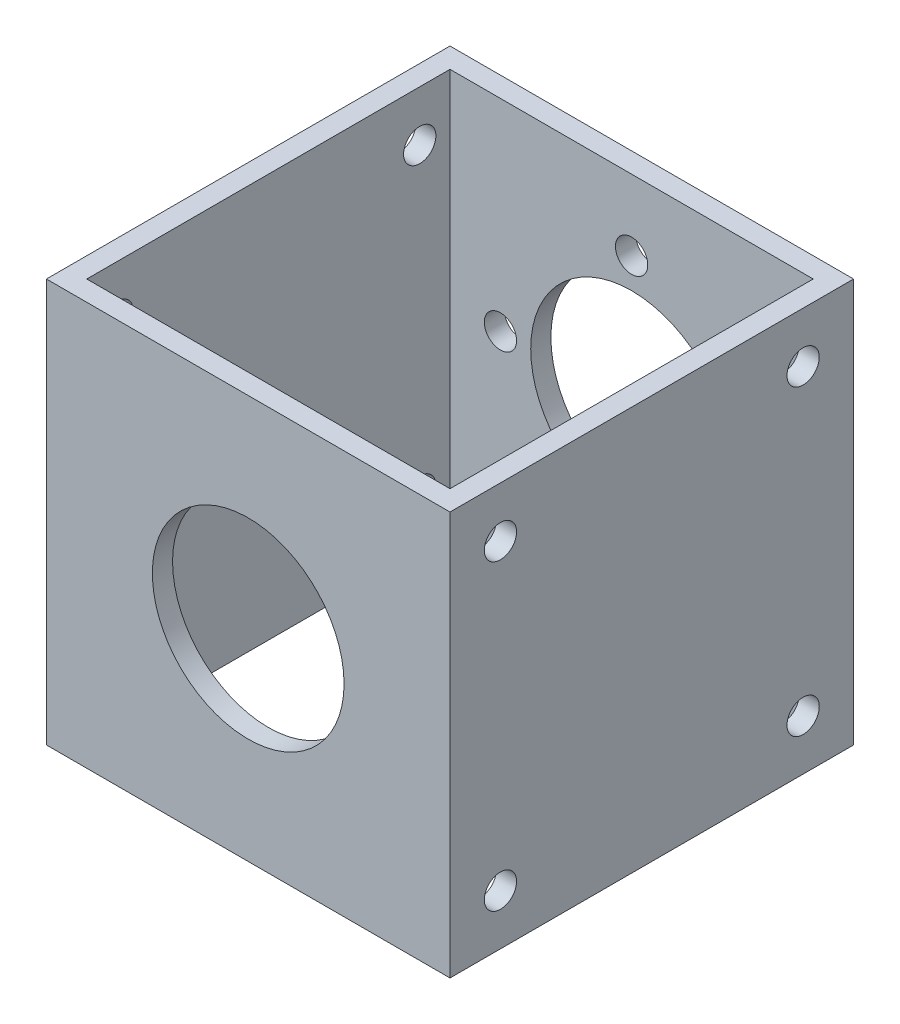
ISO-10303-21;
HEADER;
FILE_DESCRIPTION(('STEP AP214'),'2;1');
FILE_NAME('part.step','',(''),(''),'','','');
FILE_SCHEMA(('AUTOMOTIVE_DESIGN { 1 0 10303 214 1 1 1 1 }'));
ENDSEC;
DATA;
#1=APPLICATION_CONTEXT('core data for automotive mechanical design processes');
#2=APPLICATION_PROTOCOL_DEFINITION('international standard','automotive_design',2000,#1);
#3=PRODUCT_CONTEXT('',#1,'mechanical');
#4=PRODUCT('Part','Part','',(#3));
#5=PRODUCT_RELATED_PRODUCT_CATEGORY('part','',(#4));
#6=PRODUCT_DEFINITION_FORMATION('','',#4);
#7=PRODUCT_DEFINITION_CONTEXT('part definition',#1,'design');
#8=PRODUCT_DEFINITION('design','',#6,#7);
#9=PRODUCT_DEFINITION_SHAPE('','',#8);
#10=(LENGTH_UNIT() NAMED_UNIT(*) SI_UNIT(.MILLI.,.METRE.));
#11=(NAMED_UNIT(*) PLANE_ANGLE_UNIT() SI_UNIT($,.RADIAN.));
#12=(NAMED_UNIT(*) SI_UNIT($,.STERADIAN.) SOLID_ANGLE_UNIT());
#13=UNCERTAINTY_MEASURE_WITH_UNIT(LENGTH_MEASURE(1.E-05),#10,'distance_accuracy_value','');
#14=(GEOMETRIC_REPRESENTATION_CONTEXT(3) GLOBAL_UNCERTAINTY_ASSIGNED_CONTEXT((#13)) GLOBAL_UNIT_ASSIGNED_CONTEXT((#10,
#11,#12)) REPRESENTATION_CONTEXT('',''));
#15=CARTESIAN_POINT('',(0.,0.,0.));
#16=DIRECTION('',(0.,0.,1.));
#17=DIRECTION('',(1.,0.,0.));
#18=AXIS2_PLACEMENT_3D('',#15,#16,#17);
#19=CARTESIAN_POINT('',(0.,40.,0.));
#20=DIRECTION('',(0.,1.,0.));
#21=DIRECTION('',(0.,0.,1.));
#22=AXIS2_PLACEMENT_3D('',#19,#20,#21);
#23=PLANE('',#22);
#24=DIRECTION('',(0.,0.,-1.));
#25=VECTOR('',#24,1.);
#26=CARTESIAN_POINT('',(20.,40.,-20.));
#27=LINE('',#26,#25);
#28=CARTESIAN_POINT('',(20.,40.,20.));
#29=VERTEX_POINT('',#28);
#30=CARTESIAN_POINT('',(20.,40.,-20.));
#31=VERTEX_POINT('',#30);
#32=EDGE_CURVE('E144',#29,#31,#27,.T.);
#33=ORIENTED_EDGE('',*,*,#32,.T.);
#34=DIRECTION('',(-1.,0.,0.));
#35=VECTOR('',#34,1.);
#36=CARTESIAN_POINT('',(-20.,40.,-20.));
#37=LINE('',#36,#35);
#38=CARTESIAN_POINT('',(-20.,40.,-20.));
#39=VERTEX_POINT('',#38);
#40=EDGE_CURVE('E147',#31,#39,#37,.T.);
#41=ORIENTED_EDGE('',*,*,#40,.T.);
#42=DIRECTION('',(0.,0.,1.));
#43=VECTOR('',#42,1.);
#44=CARTESIAN_POINT('',(-20.,40.,-20.));
#45=LINE('',#44,#43);
#46=CARTESIAN_POINT('',(-20.,40.,20.));
#47=VERTEX_POINT('',#46);
#48=EDGE_CURVE('E150',#39,#47,#45,.T.);
#49=ORIENTED_EDGE('',*,*,#48,.T.);
#50=DIRECTION('',(1.,0.,0.));
#51=VECTOR('',#50,1.);
#52=CARTESIAN_POINT('',(-20.,40.,20.));
#53=LINE('',#52,#51);
#54=EDGE_CURVE('E152',#47,#29,#53,.T.);
#55=ORIENTED_EDGE('',*,*,#54,.T.);
#56=EDGE_LOOP('',(#33,#41,#49,#55));
#57=FACE_BOUND('',#56,.T.);
#58=DIRECTION('',(1.,0.,0.));
#59=VECTOR('',#58,1.);
#60=CARTESIAN_POINT('',(-18.,40.,18.));
#61=LINE('',#60,#59);
#62=CARTESIAN_POINT('',(-18.,40.,18.));
#63=VERTEX_POINT('',#62);
#64=CARTESIAN_POINT('',(18.,40.,18.));
#65=VERTEX_POINT('',#64);
#66=EDGE_CURVE('E114',#63,#65,#61,.T.);
#67=ORIENTED_EDGE('',*,*,#66,.F.);
#68=DIRECTION('',(0.,0.,1.));
#69=VECTOR('',#68,1.);
#70=CARTESIAN_POINT('',(-18.,40.,-18.));
#71=LINE('',#70,#69);
#72=CARTESIAN_POINT('',(-18.,40.,-18.));
#73=VERTEX_POINT('',#72);
#74=EDGE_CURVE('E106',#73,#63,#71,.T.);
#75=ORIENTED_EDGE('',*,*,#74,.F.);
#76=DIRECTION('',(-1.,0.,0.));
#77=VECTOR('',#76,1.);
#78=CARTESIAN_POINT('',(-18.,40.,-18.));
#79=LINE('',#78,#77);
#80=CARTESIAN_POINT('',(18.,40.,-18.));
#81=VERTEX_POINT('',#80);
#82=EDGE_CURVE('E128',#81,#73,#79,.T.);
#83=ORIENTED_EDGE('',*,*,#82,.F.);
#84=DIRECTION('',(0.,0.,-1.));
#85=VECTOR('',#84,1.);
#86=CARTESIAN_POINT('',(18.,40.,-18.));
#87=LINE('',#86,#85);
#88=EDGE_CURVE('E126',#65,#81,#87,.T.);
#89=ORIENTED_EDGE('',*,*,#88,.F.);
#90=EDGE_LOOP('',(#67,#75,#83,#89));
#91=FACE_BOUND('',#90,.T.);
#92=ADVANCED_FACE('F39',(#57,#91),#23,.T.);
#93=CARTESIAN_POINT('',(0.,0.,0.));
#94=DIRECTION('',(0.,1.,0.));
#95=DIRECTION('',(0.,0.,1.));
#96=AXIS2_PLACEMENT_3D('',#93,#94,#95);
#97=PLANE('',#96);
#98=DIRECTION('',(0.,0.,-1.));
#99=VECTOR('',#98,1.);
#100=CARTESIAN_POINT('',(20.,0.,-20.));
#101=LINE('',#100,#99);
#102=CARTESIAN_POINT('',(20.,0.,20.));
#103=VERTEX_POINT('',#102);
#104=CARTESIAN_POINT('',(20.,0.,-20.));
#105=VERTEX_POINT('',#104);
#106=EDGE_CURVE('E122',#103,#105,#101,.T.);
#107=ORIENTED_EDGE('',*,*,#106,.F.);
#108=DIRECTION('',(1.,0.,0.));
#109=VECTOR('',#108,1.);
#110=CARTESIAN_POINT('',(-20.,0.,20.));
#111=LINE('',#110,#109);
#112=CARTESIAN_POINT('',(-20.,0.,20.));
#113=VERTEX_POINT('',#112);
#114=EDGE_CURVE('E148',#113,#103,#111,.T.);
#115=ORIENTED_EDGE('',*,*,#114,.F.);
#116=DIRECTION('',(0.,0.,1.));
#117=VECTOR('',#116,1.);
#118=CARTESIAN_POINT('',(-20.,0.,-20.));
#119=LINE('',#118,#117);
#120=CARTESIAN_POINT('',(-20.,0.,-20.));
#121=VERTEX_POINT('',#120);
#122=EDGE_CURVE('E159',#121,#113,#119,.T.);
#123=ORIENTED_EDGE('',*,*,#122,.F.);
#124=DIRECTION('',(-1.,0.,0.));
#125=VECTOR('',#124,1.);
#126=CARTESIAN_POINT('',(-20.,0.,-20.));
#127=LINE('',#126,#125);
#128=EDGE_CURVE('E157',#105,#121,#127,.T.);
#129=ORIENTED_EDGE('',*,*,#128,.F.);
#130=EDGE_LOOP('',(#107,#115,#123,#129));
#131=FACE_BOUND('',#130,.T.);
#132=DIRECTION('',(0.,0.,1.));
#133=VECTOR('',#132,1.);
#134=CARTESIAN_POINT('',(-18.,0.,-18.));
#135=LINE('',#134,#133);
#136=CARTESIAN_POINT('',(-18.,0.,-18.));
#137=VERTEX_POINT('',#136);
#138=CARTESIAN_POINT('',(-18.,0.,18.));
#139=VERTEX_POINT('',#138);
#140=EDGE_CURVE('E64',#137,#139,#135,.T.);
#141=ORIENTED_EDGE('',*,*,#140,.T.);
#142=DIRECTION('',(1.,0.,0.));
#143=VECTOR('',#142,1.);
#144=CARTESIAN_POINT('',(-18.,0.,18.));
#145=LINE('',#144,#143);
#146=CARTESIAN_POINT('',(18.,0.,18.));
#147=VERTEX_POINT('',#146);
#148=EDGE_CURVE('E121',#139,#147,#145,.T.);
#149=ORIENTED_EDGE('',*,*,#148,.T.);
#150=DIRECTION('',(0.,0.,-1.));
#151=VECTOR('',#150,1.);
#152=CARTESIAN_POINT('',(18.,0.,-18.));
#153=LINE('',#152,#151);
#154=CARTESIAN_POINT('',(18.,0.,-18.));
#155=VERTEX_POINT('',#154);
#156=EDGE_CURVE('E136',#147,#155,#153,.T.);
#157=ORIENTED_EDGE('',*,*,#156,.T.);
#158=DIRECTION('',(-1.,0.,0.));
#159=VECTOR('',#158,1.);
#160=CARTESIAN_POINT('',(-18.,0.,-18.));
#161=LINE('',#160,#159);
#162=EDGE_CURVE('E115',#155,#137,#161,.T.);
#163=ORIENTED_EDGE('',*,*,#162,.T.);
#164=EDGE_LOOP('',(#141,#149,#157,#163));
#165=FACE_BOUND('',#164,.T.);
#166=ADVANCED_FACE('F252',(#131,#165),#97,.F.);
#167=CARTESIAN_POINT('',(20.,40.,-20.));
#168=DIRECTION('',(-1.,0.,0.));
#169=DIRECTION('',(0.,0.,1.));
#170=AXIS2_PLACEMENT_3D('',#167,#168,#169);
#171=PLANE('',#170);
#172=CARTESIAN_POINT('',(20.,5.,-15.));
#173=DIRECTION('',(-1.,0.,0.));
#174=DIRECTION('',(0.,0.,-1.));
#175=AXIS2_PLACEMENT_3D('',#172,#173,#174);
#176=CIRCLE('',#175,1.6);
#177=CARTESIAN_POINT('',(20.,5.,-16.6));
#178=VERTEX_POINT('',#177);
#179=EDGE_CURVE('E297',#178,#178,#176,.T.);
#180=ORIENTED_EDGE('',*,*,#179,.T.);
#181=EDGE_LOOP('',(#180));
#182=FACE_BOUND('',#181,.T.);
#183=CARTESIAN_POINT('',(20.,35.,15.));
#184=DIRECTION('',(-1.,0.,0.));
#185=DIRECTION('',(0.,0.,-1.));
#186=AXIS2_PLACEMENT_3D('',#183,#184,#185);
#187=CIRCLE('',#186,1.6);
#188=CARTESIAN_POINT('',(20.,35.,13.4));
#189=VERTEX_POINT('',#188);
#190=EDGE_CURVE('E300',#189,#189,#187,.T.);
#191=ORIENTED_EDGE('',*,*,#190,.T.);
#192=EDGE_LOOP('',(#191));
#193=FACE_BOUND('',#192,.T.);
#194=CARTESIAN_POINT('',(20.,35.,-15.));
#195=DIRECTION('',(-1.,0.,0.));
#196=DIRECTION('',(0.,0.,1.));
#197=AXIS2_PLACEMENT_3D('',#194,#195,#196);
#198=CIRCLE('',#197,1.6);
#199=CARTESIAN_POINT('',(20.,35.,-13.4));
#200=VERTEX_POINT('',#199);
#201=EDGE_CURVE('E306',#200,#200,#198,.T.);
#202=ORIENTED_EDGE('',*,*,#201,.T.);
#203=EDGE_LOOP('',(#202));
#204=FACE_BOUND('',#203,.T.);
#205=CARTESIAN_POINT('',(20.,5.,15.));
#206=DIRECTION('',(-1.,0.,0.));
#207=DIRECTION('',(0.,0.,1.));
#208=AXIS2_PLACEMENT_3D('',#205,#206,#207);
#209=CIRCLE('',#208,1.6);
#210=CARTESIAN_POINT('',(20.,5.,16.6));
#211=VERTEX_POINT('',#210);
#212=EDGE_CURVE('E173',#211,#211,#209,.T.);
#213=ORIENTED_EDGE('',*,*,#212,.T.);
#214=EDGE_LOOP('',(#213));
#215=FACE_BOUND('',#214,.T.);
#216=ORIENTED_EDGE('',*,*,#106,.T.);
#217=DIRECTION('',(0.,-1.,0.));
#218=VECTOR('',#217,1.);
#219=CARTESIAN_POINT('',(20.,40.,-20.));
#220=LINE('',#219,#218);
#221=EDGE_CURVE('E11',#31,#105,#220,.T.);
#222=ORIENTED_EDGE('',*,*,#221,.F.);
#223=ORIENTED_EDGE('',*,*,#32,.F.);
#224=DIRECTION('',(0.,-1.,0.));
#225=VECTOR('',#224,1.);
#226=CARTESIAN_POINT('',(20.,40.,20.));
#227=LINE('',#226,#225);
#228=EDGE_CURVE('E154',#29,#103,#227,.T.);
#229=ORIENTED_EDGE('',*,*,#228,.T.);
#230=EDGE_LOOP('',(#216,#222,#223,#229));
#231=FACE_BOUND('',#230,.T.);
#232=ADVANCED_FACE('F41',(#182,#193,#204,#215,#231),#171,.F.);
#233=CARTESIAN_POINT('',(-20.,40.,-20.));
#234=DIRECTION('',(0.,0.,1.));
#235=DIRECTION('',(1.,0.,0.));
#236=AXIS2_PLACEMENT_3D('',#233,#234,#235);
#237=PLANE('',#236);
#238=CARTESIAN_POINT('',(0.,33.,-20.));
#239=DIRECTION('',(0.,0.,-1.));
#240=DIRECTION('',(-1.,0.,0.));
#241=AXIS2_PLACEMENT_3D('',#238,#239,#240);
#242=CIRCLE('',#241,1.6);
#243=CARTESIAN_POINT('',(-1.6,33.,-20.));
#244=VERTEX_POINT('',#243);
#245=EDGE_CURVE('E217',#244,#244,#242,.T.);
#246=ORIENTED_EDGE('',*,*,#245,.F.);
#247=EDGE_LOOP('',(#246));
#248=FACE_BOUND('',#247,.T.);
#249=CARTESIAN_POINT('',(-13.0000000000002,20.0000000000001,-20.));
#250=DIRECTION('',(0.,0.,-1.));
#251=DIRECTION('',(-1.,0.,0.));
#252=AXIS2_PLACEMENT_3D('',#249,#250,#251);
#253=CIRCLE('',#252,1.6);
#254=CARTESIAN_POINT('',(-14.6000000000002,20.0000000000001,-20.));
#255=VERTEX_POINT('',#254);
#256=EDGE_CURVE('E204',#255,#255,#253,.T.);
#257=ORIENTED_EDGE('',*,*,#256,.F.);
#258=EDGE_LOOP('',(#257));
#259=FACE_BOUND('',#258,.T.);
#260=CARTESIAN_POINT('',(-2.72335544429765E-13,7.,-20.));
#261=DIRECTION('',(0.,0.,-1.));
#262=DIRECTION('',(-1.,0.,0.));
#263=AXIS2_PLACEMENT_3D('',#260,#261,#262);
#264=CIRCLE('',#263,1.6);
#265=CARTESIAN_POINT('',(-1.60000000000027,7.,-20.));
#266=VERTEX_POINT('',#265);
#267=EDGE_CURVE('E205',#266,#266,#264,.T.);
#268=ORIENTED_EDGE('',*,*,#267,.F.);
#269=EDGE_LOOP('',(#268));
#270=FACE_BOUND('',#269,.T.);
#271=CARTESIAN_POINT('',(12.9999999999998,20.,-20.));
#272=DIRECTION('',(0.,0.,-1.));
#273=DIRECTION('',(-1.,0.,0.));
#274=AXIS2_PLACEMENT_3D('',#271,#272,#273);
#275=CIRCLE('',#274,1.6);
#276=CARTESIAN_POINT('',(11.3999999999998,20.,-20.));
#277=VERTEX_POINT('',#276);
#278=EDGE_CURVE('E198',#277,#277,#275,.T.);
#279=ORIENTED_EDGE('',*,*,#278,.F.);
#280=EDGE_LOOP('',(#279));
#281=FACE_BOUND('',#280,.T.);
#282=CARTESIAN_POINT('',(0.,20.,-20.));
#283=DIRECTION('',(0.,0.,-1.));
#284=DIRECTION('',(-1.,0.,0.));
#285=AXIS2_PLACEMENT_3D('',#282,#283,#284);
#286=CIRCLE('',#285,10.);
#287=CARTESIAN_POINT('',(-10.,20.,-20.));
#288=VERTEX_POINT('',#287);
#289=EDGE_CURVE('E134',#288,#288,#286,.T.);
#290=ORIENTED_EDGE('',*,*,#289,.F.);
#291=EDGE_LOOP('',(#290));
#292=FACE_BOUND('',#291,.T.);
#293=ORIENTED_EDGE('',*,*,#128,.T.);
#294=DIRECTION('',(0.,-1.,0.));
#295=VECTOR('',#294,1.);
#296=CARTESIAN_POINT('',(-20.,40.,-20.));
#297=LINE('',#296,#295);
#298=EDGE_CURVE('E48',#39,#121,#297,.T.);
#299=ORIENTED_EDGE('',*,*,#298,.F.);
#300=ORIENTED_EDGE('',*,*,#40,.F.);
#301=ORIENTED_EDGE('',*,*,#221,.T.);
#302=EDGE_LOOP('',(#293,#299,#300,#301));
#303=FACE_BOUND('',#302,.T.);
#304=ADVANCED_FACE('F238',(#248,#259,#270,#281,#292,#303),#237,.F.);
#305=CARTESIAN_POINT('',(-20.,40.,-20.));
#306=DIRECTION('',(1.,0.,0.));
#307=DIRECTION('',(0.,0.,-1.));
#308=AXIS2_PLACEMENT_3D('',#305,#306,#307);
#309=PLANE('',#308);
#310=CARTESIAN_POINT('',(-20.,5.,-15.));
#311=DIRECTION('',(-1.,0.,0.));
#312=DIRECTION('',(0.,0.,-1.));
#313=AXIS2_PLACEMENT_3D('',#310,#311,#312);
#314=CIRCLE('',#313,1.6);
#315=CARTESIAN_POINT('',(-20.,5.,-16.6));
#316=VERTEX_POINT('',#315);
#317=EDGE_CURVE('E282',#316,#316,#314,.T.);
#318=ORIENTED_EDGE('',*,*,#317,.F.);
#319=EDGE_LOOP('',(#318));
#320=FACE_BOUND('',#319,.T.);
#321=CARTESIAN_POINT('',(-20.,35.,15.));
#322=DIRECTION('',(-1.,0.,0.));
#323=DIRECTION('',(0.,0.,-1.));
#324=AXIS2_PLACEMENT_3D('',#321,#322,#323);
#325=CIRCLE('',#324,1.6);
#326=CARTESIAN_POINT('',(-20.,35.,13.4));
#327=VERTEX_POINT('',#326);
#328=EDGE_CURVE('E286',#327,#327,#325,.T.);
#329=ORIENTED_EDGE('',*,*,#328,.F.);
#330=EDGE_LOOP('',(#329));
#331=FACE_BOUND('',#330,.T.);
#332=CARTESIAN_POINT('',(-20.,35.,-15.));
#333=DIRECTION('',(-1.,0.,0.));
#334=DIRECTION('',(0.,0.,1.));
#335=AXIS2_PLACEMENT_3D('',#332,#333,#334);
#336=CIRCLE('',#335,1.6);
#337=CARTESIAN_POINT('',(-20.,35.,-13.4));
#338=VERTEX_POINT('',#337);
#339=EDGE_CURVE('E290',#338,#338,#336,.T.);
#340=ORIENTED_EDGE('',*,*,#339,.F.);
#341=EDGE_LOOP('',(#340));
#342=FACE_BOUND('',#341,.T.);
#343=CARTESIAN_POINT('',(-20.,5.,15.));
#344=DIRECTION('',(-1.,0.,0.));
#345=DIRECTION('',(0.,0.,1.));
#346=AXIS2_PLACEMENT_3D('',#343,#344,#345);
#347=CIRCLE('',#346,1.6);
#348=CARTESIAN_POINT('',(-20.,5.,16.6));
#349=VERTEX_POINT('',#348);
#350=EDGE_CURVE('E293',#349,#349,#347,.T.);
#351=ORIENTED_EDGE('',*,*,#350,.F.);
#352=EDGE_LOOP('',(#351));
#353=FACE_BOUND('',#352,.T.);
#354=ORIENTED_EDGE('',*,*,#122,.T.);
#355=DIRECTION('',(0.,-1.,0.));
#356=VECTOR('',#355,1.);
#357=CARTESIAN_POINT('',(-20.,40.,20.));
#358=LINE('',#357,#356);
#359=EDGE_CURVE('E164',#47,#113,#358,.T.);
#360=ORIENTED_EDGE('',*,*,#359,.F.);
#361=ORIENTED_EDGE('',*,*,#48,.F.);
#362=ORIENTED_EDGE('',*,*,#298,.T.);
#363=EDGE_LOOP('',(#354,#360,#361,#362));
#364=FACE_BOUND('',#363,.T.);
#365=ADVANCED_FACE('F241',(#320,#331,#342,#353,#364),#309,.F.);
#366=CARTESIAN_POINT('',(-20.,40.,20.));
#367=DIRECTION('',(0.,0.,-1.));
#368=DIRECTION('',(-1.,0.,0.));
#369=AXIS2_PLACEMENT_3D('',#366,#367,#368);
#370=PLANE('',#369);
#371=CARTESIAN_POINT('',(0.,20.,20.));
#372=DIRECTION('',(0.,0.,1.));
#373=DIRECTION('',(1.,0.,0.));
#374=AXIS2_PLACEMENT_3D('',#371,#372,#373);
#375=CIRCLE('',#374,9.5);
#376=CARTESIAN_POINT('',(9.5,20.,20.));
#377=VERTEX_POINT('',#376);
#378=EDGE_CURVE('E195',#377,#377,#375,.T.);
#379=ORIENTED_EDGE('',*,*,#378,.F.);
#380=EDGE_LOOP('',(#379));
#381=FACE_BOUND('',#380,.T.);
#382=ORIENTED_EDGE('',*,*,#114,.T.);
#383=ORIENTED_EDGE('',*,*,#228,.F.);
#384=ORIENTED_EDGE('',*,*,#54,.F.);
#385=ORIENTED_EDGE('',*,*,#359,.T.);
#386=EDGE_LOOP('',(#382,#383,#384,#385));
#387=FACE_BOUND('',#386,.T.);
#388=ADVANCED_FACE('F256',(#381,#387),#370,.F.);
#389=CARTESIAN_POINT('',(-18.,40.,-18.));
#390=DIRECTION('',(1.,0.,0.));
#391=DIRECTION('',(0.,0.,-1.));
#392=AXIS2_PLACEMENT_3D('',#389,#390,#391);
#393=PLANE('',#392);
#394=CARTESIAN_POINT('',(-18.,5.,-15.));
#395=DIRECTION('',(1.,0.,0.));
#396=DIRECTION('',(0.,0.,-1.));
#397=AXIS2_PLACEMENT_3D('',#394,#395,#396);
#398=CIRCLE('',#397,1.6);
#399=CARTESIAN_POINT('',(-18.,5.,-16.6));
#400=VERTEX_POINT('',#399);
#401=EDGE_CURVE('E191',#400,#400,#398,.T.);
#402=ORIENTED_EDGE('',*,*,#401,.F.);
#403=EDGE_LOOP('',(#402));
#404=FACE_BOUND('',#403,.T.);
#405=CARTESIAN_POINT('',(-18.,35.,15.));
#406=DIRECTION('',(1.,0.,0.));
#407=DIRECTION('',(0.,0.,-1.));
#408=AXIS2_PLACEMENT_3D('',#405,#406,#407);
#409=CIRCLE('',#408,1.6);
#410=CARTESIAN_POINT('',(-18.,35.,13.4));
#411=VERTEX_POINT('',#410);
#412=EDGE_CURVE('E179',#411,#411,#409,.T.);
#413=ORIENTED_EDGE('',*,*,#412,.F.);
#414=EDGE_LOOP('',(#413));
#415=FACE_BOUND('',#414,.T.);
#416=CARTESIAN_POINT('',(-18.,35.,-15.));
#417=DIRECTION('',(1.,0.,0.));
#418=DIRECTION('',(0.,0.,-1.));
#419=AXIS2_PLACEMENT_3D('',#416,#417,#418);
#420=CIRCLE('',#419,1.6);
#421=CARTESIAN_POINT('',(-18.,35.,-16.6));
#422=VERTEX_POINT('',#421);
#423=EDGE_CURVE('E176',#422,#422,#420,.T.);
#424=ORIENTED_EDGE('',*,*,#423,.F.);
#425=EDGE_LOOP('',(#424));
#426=FACE_BOUND('',#425,.T.);
#427=CARTESIAN_POINT('',(-18.,5.,15.));
#428=DIRECTION('',(1.,0.,0.));
#429=DIRECTION('',(0.,0.,-1.));
#430=AXIS2_PLACEMENT_3D('',#427,#428,#429);
#431=CIRCLE('',#430,1.6);
#432=CARTESIAN_POINT('',(-18.,5.,13.4));
#433=VERTEX_POINT('',#432);
#434=EDGE_CURVE('E172',#433,#433,#431,.T.);
#435=ORIENTED_EDGE('',*,*,#434,.F.);
#436=EDGE_LOOP('',(#435));
#437=FACE_BOUND('',#436,.T.);
#438=ORIENTED_EDGE('',*,*,#140,.F.);
#439=DIRECTION('',(0.,-1.,0.));
#440=VECTOR('',#439,1.);
#441=CARTESIAN_POINT('',(-18.,40.,-18.));
#442=LINE('',#441,#440);
#443=EDGE_CURVE('E110',#73,#137,#442,.T.);
#444=ORIENTED_EDGE('',*,*,#443,.F.);
#445=ORIENTED_EDGE('',*,*,#74,.T.);
#446=DIRECTION('',(0.,-1.,0.));
#447=VECTOR('',#446,1.);
#448=CARTESIAN_POINT('',(-18.,40.,18.));
#449=LINE('',#448,#447);
#450=EDGE_CURVE('E109',#63,#139,#449,.T.);
#451=ORIENTED_EDGE('',*,*,#450,.T.);
#452=EDGE_LOOP('',(#438,#444,#445,#451));
#453=FACE_BOUND('',#452,.T.);
#454=ADVANCED_FACE('F108',(#404,#415,#426,#437,#453),#393,.T.);
#455=CARTESIAN_POINT('',(-18.,40.,18.));
#456=DIRECTION('',(0.,0.,-1.));
#457=DIRECTION('',(-1.,0.,0.));
#458=AXIS2_PLACEMENT_3D('',#455,#456,#457);
#459=PLANE('',#458);
#460=CARTESIAN_POINT('',(0.,20.,18.));
#461=DIRECTION('',(0.,0.,-1.));
#462=DIRECTION('',(-1.,0.,0.));
#463=AXIS2_PLACEMENT_3D('',#460,#461,#462);
#464=CIRCLE('',#463,9.5);
#465=CARTESIAN_POINT('',(-9.5,20.,18.));
#466=VERTEX_POINT('',#465);
#467=EDGE_CURVE('E194',#466,#466,#464,.F.);
#468=ORIENTED_EDGE('',*,*,#467,.T.);
#469=EDGE_LOOP('',(#468));
#470=FACE_BOUND('',#469,.T.);
#471=ORIENTED_EDGE('',*,*,#148,.F.);
#472=ORIENTED_EDGE('',*,*,#450,.F.);
#473=ORIENTED_EDGE('',*,*,#66,.T.);
#474=DIRECTION('',(0.,-1.,0.));
#475=VECTOR('',#474,1.);
#476=CARTESIAN_POINT('',(18.,40.,18.));
#477=LINE('',#476,#475);
#478=EDGE_CURVE('E123',#65,#147,#477,.T.);
#479=ORIENTED_EDGE('',*,*,#478,.T.);
#480=EDGE_LOOP('',(#471,#472,#473,#479));
#481=FACE_BOUND('',#480,.T.);
#482=ADVANCED_FACE('F118',(#470,#481),#459,.T.);
#483=CARTESIAN_POINT('',(18.,40.,-18.));
#484=DIRECTION('',(-1.,0.,0.));
#485=DIRECTION('',(0.,0.,1.));
#486=AXIS2_PLACEMENT_3D('',#483,#484,#485);
#487=PLANE('',#486);
#488=CARTESIAN_POINT('',(18.,5.,-15.));
#489=DIRECTION('',(-1.,0.,0.));
#490=DIRECTION('',(0.,0.,1.));
#491=AXIS2_PLACEMENT_3D('',#488,#489,#490);
#492=CIRCLE('',#491,1.6);
#493=CARTESIAN_POINT('',(18.,5.,-13.4));
#494=VERTEX_POINT('',#493);
#495=EDGE_CURVE('E43',#494,#494,#492,.T.);
#496=ORIENTED_EDGE('',*,*,#495,.F.);
#497=EDGE_LOOP('',(#496));
#498=FACE_BOUND('',#497,.T.);
#499=CARTESIAN_POINT('',(18.,35.,15.));
#500=DIRECTION('',(-1.,0.,0.));
#501=DIRECTION('',(0.,0.,1.));
#502=AXIS2_PLACEMENT_3D('',#499,#500,#501);
#503=CIRCLE('',#502,1.6);
#504=CARTESIAN_POINT('',(18.,35.,16.6));
#505=VERTEX_POINT('',#504);
#506=EDGE_CURVE('E177',#505,#505,#503,.T.);
#507=ORIENTED_EDGE('',*,*,#506,.F.);
#508=EDGE_LOOP('',(#507));
#509=FACE_BOUND('',#508,.T.);
#510=CARTESIAN_POINT('',(18.,35.,-15.));
#511=DIRECTION('',(-1.,0.,0.));
#512=DIRECTION('',(0.,0.,1.));
#513=AXIS2_PLACEMENT_3D('',#510,#511,#512);
#514=CIRCLE('',#513,1.6);
#515=CARTESIAN_POINT('',(18.,35.,-13.4));
#516=VERTEX_POINT('',#515);
#517=EDGE_CURVE('E174',#516,#516,#514,.T.);
#518=ORIENTED_EDGE('',*,*,#517,.F.);
#519=EDGE_LOOP('',(#518));
#520=FACE_BOUND('',#519,.T.);
#521=CARTESIAN_POINT('',(18.,5.,15.));
#522=DIRECTION('',(-1.,0.,0.));
#523=DIRECTION('',(0.,0.,1.));
#524=AXIS2_PLACEMENT_3D('',#521,#522,#523);
#525=CIRCLE('',#524,1.6);
#526=CARTESIAN_POINT('',(18.,5.,16.6));
#527=VERTEX_POINT('',#526);
#528=EDGE_CURVE('E169',#527,#527,#525,.T.);
#529=ORIENTED_EDGE('',*,*,#528,.F.);
#530=EDGE_LOOP('',(#529));
#531=FACE_BOUND('',#530,.T.);
#532=ORIENTED_EDGE('',*,*,#156,.F.);
#533=ORIENTED_EDGE('',*,*,#478,.F.);
#534=ORIENTED_EDGE('',*,*,#88,.T.);
#535=DIRECTION('',(0.,-1.,0.));
#536=VECTOR('',#535,1.);
#537=CARTESIAN_POINT('',(18.,40.,-18.));
#538=LINE('',#537,#536);
#539=EDGE_CURVE('E56',#81,#155,#538,.T.);
#540=ORIENTED_EDGE('',*,*,#539,.T.);
#541=EDGE_LOOP('',(#532,#533,#534,#540));
#542=FACE_BOUND('',#541,.T.);
#543=ADVANCED_FACE('F376',(#498,#509,#520,#531,#542),#487,.T.);
#544=CARTESIAN_POINT('',(-18.,40.,-18.));
#545=DIRECTION('',(0.,0.,1.));
#546=DIRECTION('',(1.,0.,0.));
#547=AXIS2_PLACEMENT_3D('',#544,#545,#546);
#548=PLANE('',#547);
#549=CARTESIAN_POINT('',(0.,33.,-18.));
#550=DIRECTION('',(0.,0.,1.));
#551=DIRECTION('',(1.,0.,0.));
#552=AXIS2_PLACEMENT_3D('',#549,#550,#551);
#553=CIRCLE('',#552,1.6);
#554=CARTESIAN_POINT('',(1.6,33.,-18.));
#555=VERTEX_POINT('',#554);
#556=EDGE_CURVE('E213',#555,#555,#553,.F.);
#557=ORIENTED_EDGE('',*,*,#556,.T.);
#558=EDGE_LOOP('',(#557));
#559=FACE_BOUND('',#558,.T.);
#560=CARTESIAN_POINT('',(-13.0000000000002,20.0000000000001,-18.));
#561=DIRECTION('',(0.,0.,1.));
#562=DIRECTION('',(1.,0.,0.));
#563=AXIS2_PLACEMENT_3D('',#560,#561,#562);
#564=CIRCLE('',#563,1.6);
#565=CARTESIAN_POINT('',(-11.4000000000002,20.0000000000001,-18.));
#566=VERTEX_POINT('',#565);
#567=EDGE_CURVE('E220',#566,#566,#564,.F.);
#568=ORIENTED_EDGE('',*,*,#567,.T.);
#569=EDGE_LOOP('',(#568));
#570=FACE_BOUND('',#569,.T.);
#571=CARTESIAN_POINT('',(-2.72335544429765E-13,7.,-18.));
#572=DIRECTION('',(0.,0.,1.));
#573=DIRECTION('',(1.,0.,0.));
#574=AXIS2_PLACEMENT_3D('',#571,#572,#573);
#575=CIRCLE('',#574,1.6);
#576=CARTESIAN_POINT('',(1.59999999999973,7.,-18.));
#577=VERTEX_POINT('',#576);
#578=EDGE_CURVE('E201',#577,#577,#575,.F.);
#579=ORIENTED_EDGE('',*,*,#578,.T.);
#580=EDGE_LOOP('',(#579));
#581=FACE_BOUND('',#580,.T.);
#582=CARTESIAN_POINT('',(12.9999999999998,20.,-18.));
#583=DIRECTION('',(0.,0.,1.));
#584=DIRECTION('',(1.,0.,0.));
#585=AXIS2_PLACEMENT_3D('',#582,#583,#584);
#586=CIRCLE('',#585,1.6);
#587=CARTESIAN_POINT('',(14.5999999999998,20.,-18.));
#588=VERTEX_POINT('',#587);
#589=EDGE_CURVE('E208',#588,#588,#586,.F.);
#590=ORIENTED_EDGE('',*,*,#589,.T.);
#591=EDGE_LOOP('',(#590));
#592=FACE_BOUND('',#591,.T.);
#593=CARTESIAN_POINT('',(0.,20.,-18.));
#594=DIRECTION('',(0.,0.,1.));
#595=DIRECTION('',(1.,0.,0.));
#596=AXIS2_PLACEMENT_3D('',#593,#594,#595);
#597=CIRCLE('',#596,10.);
#598=CARTESIAN_POINT('',(10.,20.,-18.));
#599=VERTEX_POINT('',#598);
#600=EDGE_CURVE('E216',#599,#599,#597,.F.);
#601=ORIENTED_EDGE('',*,*,#600,.T.);
#602=EDGE_LOOP('',(#601));
#603=FACE_BOUND('',#602,.T.);
#604=ORIENTED_EDGE('',*,*,#162,.F.);
#605=ORIENTED_EDGE('',*,*,#539,.F.);
#606=ORIENTED_EDGE('',*,*,#82,.T.);
#607=ORIENTED_EDGE('',*,*,#443,.T.);
#608=EDGE_LOOP('',(#604,#605,#606,#607));
#609=FACE_BOUND('',#608,.T.);
#610=ADVANCED_FACE('F229',(#559,#570,#581,#592,#603,#609),#548,.T.);
#611=CARTESIAN_POINT('',(0.,20.,20.001));
#612=DIRECTION('',(0.,0.,-1.));
#613=DIRECTION('',(-1.,0.,0.));
#614=AXIS2_PLACEMENT_3D('',#611,#612,#613);
#615=CYLINDRICAL_SURFACE('',#614,10.);
#616=ORIENTED_EDGE('',*,*,#600,.F.);
#617=EDGE_LOOP('',(#616));
#618=FACE_BOUND('',#617,.T.);
#619=ORIENTED_EDGE('',*,*,#289,.T.);
#620=EDGE_LOOP('',(#619));
#621=FACE_BOUND('',#620,.T.);
#622=ADVANCED_FACE('F231',(#618,#621),#615,.F.);
#623=CARTESIAN_POINT('',(12.9999999999998,20.,20.001));
#624=DIRECTION('',(0.,0.,-1.));
#625=DIRECTION('',(-1.,0.,0.));
#626=AXIS2_PLACEMENT_3D('',#623,#624,#625);
#627=CYLINDRICAL_SURFACE('',#626,1.6);
#628=ORIENTED_EDGE('',*,*,#589,.F.);
#629=EDGE_LOOP('',(#628));
#630=FACE_BOUND('',#629,.T.);
#631=ORIENTED_EDGE('',*,*,#278,.T.);
#632=EDGE_LOOP('',(#631));
#633=FACE_BOUND('',#632,.T.);
#634=ADVANCED_FACE('F234',(#630,#633),#627,.F.);
#635=CARTESIAN_POINT('',(-2.72335544429765E-13,7.,20.001));
#636=DIRECTION('',(0.,0.,-1.));
#637=DIRECTION('',(-1.,0.,0.));
#638=AXIS2_PLACEMENT_3D('',#635,#636,#637);
#639=CYLINDRICAL_SURFACE('',#638,1.6);
#640=ORIENTED_EDGE('',*,*,#578,.F.);
#641=EDGE_LOOP('',(#640));
#642=FACE_BOUND('',#641,.T.);
#643=ORIENTED_EDGE('',*,*,#267,.T.);
#644=EDGE_LOOP('',(#643));
#645=FACE_BOUND('',#644,.T.);
#646=ADVANCED_FACE('F390',(#642,#645),#639,.F.);
#647=CARTESIAN_POINT('',(-13.0000000000002,20.0000000000001,20.001));
#648=DIRECTION('',(0.,0.,-1.));
#649=DIRECTION('',(-1.,0.,0.));
#650=AXIS2_PLACEMENT_3D('',#647,#648,#649);
#651=CYLINDRICAL_SURFACE('',#650,1.6);
#652=ORIENTED_EDGE('',*,*,#567,.F.);
#653=EDGE_LOOP('',(#652));
#654=FACE_BOUND('',#653,.T.);
#655=ORIENTED_EDGE('',*,*,#256,.T.);
#656=EDGE_LOOP('',(#655));
#657=FACE_BOUND('',#656,.T.);
#658=ADVANCED_FACE('F386',(#654,#657),#651,.F.);
#659=CARTESIAN_POINT('',(0.,33.,20.001));
#660=DIRECTION('',(0.,0.,-1.));
#661=DIRECTION('',(-1.,0.,0.));
#662=AXIS2_PLACEMENT_3D('',#659,#660,#661);
#663=CYLINDRICAL_SURFACE('',#662,1.6);
#664=ORIENTED_EDGE('',*,*,#556,.F.);
#665=EDGE_LOOP('',(#664));
#666=FACE_BOUND('',#665,.T.);
#667=ORIENTED_EDGE('',*,*,#245,.T.);
#668=EDGE_LOOP('',(#667));
#669=FACE_BOUND('',#668,.T.);
#670=ADVANCED_FACE('F389',(#666,#669),#663,.F.);
#671=CARTESIAN_POINT('',(0.,20.,-20.001));
#672=DIRECTION('',(0.,0.,1.));
#673=DIRECTION('',(1.,0.,0.));
#674=AXIS2_PLACEMENT_3D('',#671,#672,#673);
#675=CYLINDRICAL_SURFACE('',#674,9.5);
#676=ORIENTED_EDGE('',*,*,#467,.F.);
#677=EDGE_LOOP('',(#676));
#678=FACE_BOUND('',#677,.T.);
#679=ORIENTED_EDGE('',*,*,#378,.T.);
#680=EDGE_LOOP('',(#679));
#681=FACE_BOUND('',#680,.T.);
#682=ADVANCED_FACE('F335',(#678,#681),#675,.F.);
#683=CARTESIAN_POINT('',(20.,5.,15.));
#684=DIRECTION('',(-1.,0.,0.));
#685=DIRECTION('',(0.,0.,1.));
#686=AXIS2_PLACEMENT_3D('',#683,#684,#685);
#687=CYLINDRICAL_SURFACE('',#686,1.6);
#688=ORIENTED_EDGE('',*,*,#528,.T.);
#689=EDGE_LOOP('',(#688));
#690=FACE_BOUND('',#689,.T.);
#691=ORIENTED_EDGE('',*,*,#212,.F.);
#692=EDGE_LOOP('',(#691));
#693=FACE_BOUND('',#692,.T.);
#694=ADVANCED_FACE('F327',(#690,#693),#687,.F.);
#695=CARTESIAN_POINT('',(20.,35.,-15.));
#696=DIRECTION('',(-1.,0.,0.));
#697=DIRECTION('',(0.,0.,1.));
#698=AXIS2_PLACEMENT_3D('',#695,#696,#697);
#699=CYLINDRICAL_SURFACE('',#698,1.6);
#700=ORIENTED_EDGE('',*,*,#517,.T.);
#701=EDGE_LOOP('',(#700));
#702=FACE_BOUND('',#701,.T.);
#703=ORIENTED_EDGE('',*,*,#201,.F.);
#704=EDGE_LOOP('',(#703));
#705=FACE_BOUND('',#704,.T.);
#706=ADVANCED_FACE('F315',(#702,#705),#699,.F.);
#707=CARTESIAN_POINT('',(20.,35.,15.));
#708=DIRECTION('',(-1.,0.,0.));
#709=DIRECTION('',(0.,0.,1.));
#710=AXIS2_PLACEMENT_3D('',#707,#708,#709);
#711=CYLINDRICAL_SURFACE('',#710,1.6);
#712=ORIENTED_EDGE('',*,*,#506,.T.);
#713=EDGE_LOOP('',(#712));
#714=FACE_BOUND('',#713,.T.);
#715=ORIENTED_EDGE('',*,*,#190,.F.);
#716=EDGE_LOOP('',(#715));
#717=FACE_BOUND('',#716,.T.);
#718=ADVANCED_FACE('F323',(#714,#717),#711,.F.);
#719=CARTESIAN_POINT('',(20.,5.,-15.));
#720=DIRECTION('',(-1.,0.,0.));
#721=DIRECTION('',(0.,0.,1.));
#722=AXIS2_PLACEMENT_3D('',#719,#720,#721);
#723=CYLINDRICAL_SURFACE('',#722,1.6);
#724=ORIENTED_EDGE('',*,*,#495,.T.);
#725=EDGE_LOOP('',(#724));
#726=FACE_BOUND('',#725,.T.);
#727=ORIENTED_EDGE('',*,*,#179,.F.);
#728=EDGE_LOOP('',(#727));
#729=FACE_BOUND('',#728,.T.);
#730=ADVANCED_FACE('F324',(#726,#729),#723,.F.);
#731=ORIENTED_EDGE('',*,*,#434,.T.);
#732=EDGE_LOOP('',(#731));
#733=FACE_BOUND('',#732,.T.);
#734=ORIENTED_EDGE('',*,*,#350,.T.);
#735=EDGE_LOOP('',(#734));
#736=FACE_BOUND('',#735,.T.);
#737=ADVANCED_FACE('F313',(#733,#736),#687,.F.);
#738=ORIENTED_EDGE('',*,*,#423,.T.);
#739=EDGE_LOOP('',(#738));
#740=FACE_BOUND('',#739,.T.);
#741=ORIENTED_EDGE('',*,*,#339,.T.);
#742=EDGE_LOOP('',(#741));
#743=FACE_BOUND('',#742,.T.);
#744=ADVANCED_FACE('F310',(#740,#743),#699,.F.);
#745=ORIENTED_EDGE('',*,*,#412,.T.);
#746=EDGE_LOOP('',(#745));
#747=FACE_BOUND('',#746,.T.);
#748=ORIENTED_EDGE('',*,*,#328,.T.);
#749=EDGE_LOOP('',(#748));
#750=FACE_BOUND('',#749,.T.);
#751=ADVANCED_FACE('F312',(#747,#750),#711,.F.);
#752=ORIENTED_EDGE('',*,*,#401,.T.);
#753=EDGE_LOOP('',(#752));
#754=FACE_BOUND('',#753,.T.);
#755=ORIENTED_EDGE('',*,*,#317,.T.);
#756=EDGE_LOOP('',(#755));
#757=FACE_BOUND('',#756,.T.);
#758=ADVANCED_FACE('F320',(#754,#757),#723,.F.);
#759=CLOSED_SHELL('',(#92,#166,#232,#304,#365,#388,#454,#482,#543,#610,#622,#634,#646,#658,#670,
#682,#694,#706,#718,#730,#737,#744,#751,#758));
#760=MANIFOLD_SOLID_BREP('B2',#759);
#761=ADVANCED_BREP_SHAPE_REPRESENTATION('',(#18,#760),#14);
#762=SHAPE_DEFINITION_REPRESENTATION(#9,#761);
ENDSEC;
END-ISO-10303-21;
